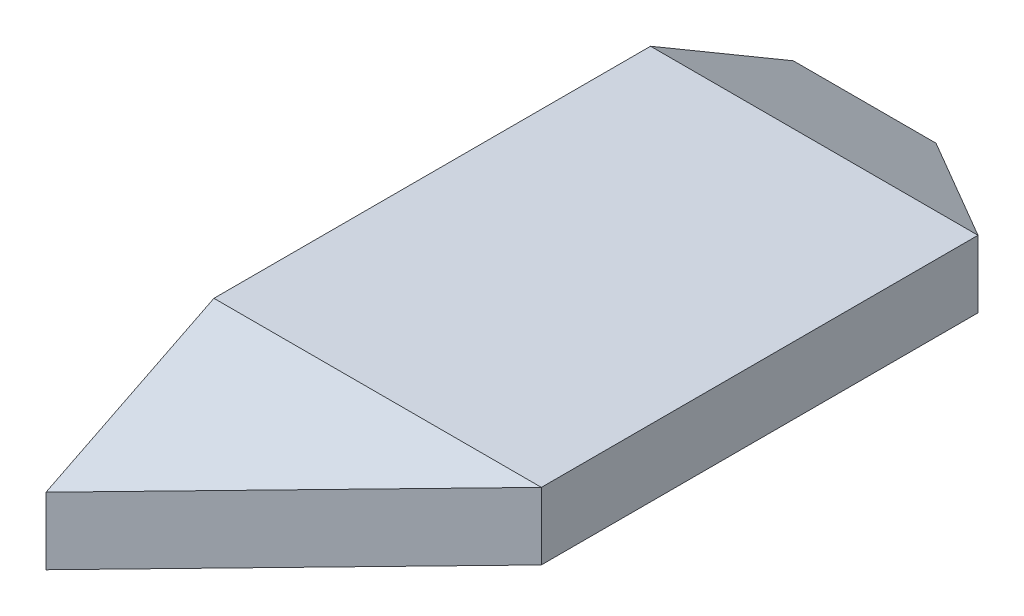
ISO-10303-21;
HEADER;
FILE_DESCRIPTION(('STEP AP214'),'2;1');
FILE_NAME('part.step','',(''),(''),'','','');
FILE_SCHEMA(('AUTOMOTIVE_DESIGN { 1 0 10303 214 1 1 1 1 }'));
ENDSEC;
DATA;
#1=APPLICATION_CONTEXT('core data for automotive mechanical design processes');
#2=APPLICATION_PROTOCOL_DEFINITION('international standard','automotive_design',2000,#1);
#3=PRODUCT_CONTEXT('',#1,'mechanical');
#4=PRODUCT('Part','Part','',(#3));
#5=PRODUCT_RELATED_PRODUCT_CATEGORY('part','',(#4));
#6=PRODUCT_DEFINITION_FORMATION('','',#4);
#7=PRODUCT_DEFINITION_CONTEXT('part definition',#1,'design');
#8=PRODUCT_DEFINITION('design','',#6,#7);
#9=PRODUCT_DEFINITION_SHAPE('','',#8);
#10=(LENGTH_UNIT() NAMED_UNIT(*) SI_UNIT(.MILLI.,.METRE.));
#11=(NAMED_UNIT(*) PLANE_ANGLE_UNIT() SI_UNIT($,.RADIAN.));
#12=(NAMED_UNIT(*) SI_UNIT($,.STERADIAN.) SOLID_ANGLE_UNIT());
#13=UNCERTAINTY_MEASURE_WITH_UNIT(LENGTH_MEASURE(1.E-05),#10,'distance_accuracy_value','');
#14=(GEOMETRIC_REPRESENTATION_CONTEXT(3) GLOBAL_UNCERTAINTY_ASSIGNED_CONTEXT((#13)) GLOBAL_UNIT_ASSIGNED_CONTEXT((#10,
#11,#12)) REPRESENTATION_CONTEXT('',''));
#15=CARTESIAN_POINT('',(0.,0.,0.));
#16=DIRECTION('',(0.,0.,1.));
#17=DIRECTION('',(1.,0.,0.));
#18=AXIS2_PLACEMENT_3D('',#15,#16,#17);
#19=CARTESIAN_POINT('',(0.,0.,0.));
#20=DIRECTION('',(0.,-1.,0.));
#21=DIRECTION('',(0.,0.,-1.));
#22=AXIS2_PLACEMENT_3D('',#19,#20,#21);
#23=PLANE('',#22);
#24=DIRECTION('',(-1.,0.,0.));
#25=VECTOR('',#24,1.);
#26=CARTESIAN_POINT('',(97.5,0.,-130.));
#27=LINE('',#26,#25);
#28=CARTESIAN_POINT('',(-92.5,0.,-130.));
#29=VERTEX_POINT('',#28);
#30=CARTESIAN_POINT('',(-97.5,0.,-130.));
#31=VERTEX_POINT('',#30);
#32=EDGE_CURVE('E285',#29,#31,#27,.T.);
#33=ORIENTED_EDGE('',*,*,#32,.F.);
#34=DIRECTION('',(0.,0.,1.));
#35=VECTOR('',#34,1.);
#36=CARTESIAN_POINT('',(-92.5,0.,0.));
#37=LINE('',#36,#35);
#38=CARTESIAN_POINT('',(-92.5,0.,130.));
#39=VERTEX_POINT('',#38);
#40=EDGE_CURVE('E181',#29,#39,#37,.T.);
#41=ORIENTED_EDGE('',*,*,#40,.T.);
#42=DIRECTION('',(1.,0.,0.));
#43=VECTOR('',#42,1.);
#44=CARTESIAN_POINT('',(97.5,0.,130.));
#45=LINE('',#44,#43);
#46=CARTESIAN_POINT('',(-97.5,0.,130.));
#47=VERTEX_POINT('',#46);
#48=EDGE_CURVE('E279',#47,#39,#45,.T.);
#49=ORIENTED_EDGE('',*,*,#48,.F.);
#50=DIRECTION('',(0.,0.,1.));
#51=VECTOR('',#50,1.);
#52=CARTESIAN_POINT('',(-97.5,0.,-130.));
#53=LINE('',#52,#51);
#54=EDGE_CURVE('E265',#31,#47,#53,.T.);
#55=ORIENTED_EDGE('',*,*,#54,.F.);
#56=EDGE_LOOP('',(#33,#41,#49,#55));
#57=FACE_BOUND('',#56,.T.);
#58=ADVANCED_FACE('F43',(#57),#23,.T.);
#59=CARTESIAN_POINT('',(97.5,-50.,230.));
#60=DIRECTION('',(0.,0.894427190999916,0.447213595499958));
#61=DIRECTION('',(0.,-0.447213595499958,0.894427190999916));
#62=AXIS2_PLACEMENT_3D('',#59,#60,#61);
#63=PLANE('',#62);
#64=DIRECTION('',(-0.867523903935252,-0.222442026650064,0.444884053300129));
#65=VECTOR('',#64,1.);
#66=CARTESIAN_POINT('',(46.5456943343876,-10.2556415808223,150.511283161645));
#67=LINE('',#66,#65);
#68=CARTESIAN_POINT('',(86.5426964995944,0.,130.));
#69=VERTEX_POINT('',#68);
#70=CARTESIAN_POINT('',(-92.5,-45.9083837178447,221.816767435689));
#71=VERTEX_POINT('',#70);
#72=EDGE_CURVE('E191',#69,#71,#67,.T.);
#73=ORIENTED_EDGE('',*,*,#72,.F.);
#74=CARTESIAN_POINT('',(97.5,0.,130.));
#75=VERTEX_POINT('',#74);
#76=EDGE_CURVE('E278',#69,#75,#45,.T.);
#77=ORIENTED_EDGE('',*,*,#76,.T.);
#78=DIRECTION('',(-0.867523903935252,-0.222442026650064,0.444884053300129));
#79=VECTOR('',#78,1.);
#80=CARTESIAN_POINT('',(49.2565561603167,-12.370113805047,154.740227610094));
#81=LINE('',#80,#79);
#82=CARTESIAN_POINT('',(-97.5,-50.,230.));
#83=VERTEX_POINT('',#82);
#84=EDGE_CURVE('E241',#75,#83,#81,.T.);
#85=ORIENTED_EDGE('',*,*,#84,.T.);
#86=DIRECTION('',(0.,0.447213595499958,-0.894427190999916));
#87=VECTOR('',#86,1.);
#88=CARTESIAN_POINT('',(-97.5,-50.,230.));
#89=LINE('',#88,#87);
#90=EDGE_CURVE('E259',#83,#47,#89,.T.);
#91=ORIENTED_EDGE('',*,*,#90,.T.);
#92=ORIENTED_EDGE('',*,*,#48,.T.);
#93=DIRECTION('',(0.,0.447213595499958,-0.894427190999916));
#94=VECTOR('',#93,1.);
#95=CARTESIAN_POINT('',(-92.5,-50.,230.));
#96=LINE('',#95,#94);
#97=EDGE_CURVE('E182',#71,#39,#96,.T.);
#98=ORIENTED_EDGE('',*,*,#97,.F.);
#99=EDGE_LOOP('',(#73,#77,#85,#91,#92,#98));
#100=FACE_BOUND('',#99,.T.);
#101=ADVANCED_FACE('F331',(#100),#63,.F.);
#102=CARTESIAN_POINT('',(97.5,0.,-130.));
#103=DIRECTION('',(0.,-0.86193421515777,0.507020126563394));
#104=DIRECTION('',(0.,-0.507020126563394,-0.86193421515777));
#105=AXIS2_PLACEMENT_3D('',#102,#103,#104);
#106=PLANE('',#105);
#107=CARTESIAN_POINT('',(97.5,0.,-130.));
#108=VERTEX_POINT('',#107);
#109=CARTESIAN_POINT('',(89.3226830738483,0.,-130.));
#110=VERTEX_POINT('',#109);
#111=EDGE_CURVE('E269',#108,#110,#27,.T.);
#112=ORIENTED_EDGE('',*,*,#111,.T.);
#113=DIRECTION('',(-0.744587187764654,-0.338448721711206,-0.575362826909051));
#114=VECTOR('',#113,1.);
#115=CARTESIAN_POINT('',(93.8562700065602,2.06072133305081,-126.496773733814));
#116=LINE('',#115,#114);
#117=CARTESIAN_POINT('',(-14.2067286908576,-47.0588235294118,-210.));
#118=VERTEX_POINT('',#117);
#119=EDGE_CURVE('E202',#110,#118,#116,.T.);
#120=ORIENTED_EDGE('',*,*,#119,.T.);
#121=DIRECTION('',(-1.,0.,0.));
#122=VECTOR('',#121,1.);
#123=CARTESIAN_POINT('',(97.5,-47.0588235294118,-210.));
#124=LINE('',#123,#122);
#125=CARTESIAN_POINT('',(-92.5,-47.0588235294118,-210.));
#126=VERTEX_POINT('',#125);
#127=EDGE_CURVE('E211',#118,#126,#124,.T.);
#128=ORIENTED_EDGE('',*,*,#127,.T.);
#129=DIRECTION('',(0.,0.507020126563394,0.86193421515777));
#130=VECTOR('',#129,1.);
#131=CARTESIAN_POINT('',(-92.5,0.,-130.));
#132=LINE('',#131,#130);
#133=EDGE_CURVE('E192',#126,#29,#132,.T.);
#134=ORIENTED_EDGE('',*,*,#133,.T.);
#135=ORIENTED_EDGE('',*,*,#32,.T.);
#136=DIRECTION('',(0.,0.507020126563394,0.861934215157769));
#137=VECTOR('',#136,1.);
#138=CARTESIAN_POINT('',(-97.5,0.,-130.));
#139=LINE('',#138,#137);
#140=CARTESIAN_POINT('',(-97.5,-50.,-215.));
#141=VERTEX_POINT('',#140);
#142=EDGE_CURVE('E250',#141,#31,#139,.T.);
#143=ORIENTED_EDGE('',*,*,#142,.F.);
#144=DIRECTION('',(-1.,0.,0.));
#145=VECTOR('',#144,1.);
#146=CARTESIAN_POINT('',(97.5,-50.,-215.));
#147=LINE('',#146,#145);
#148=CARTESIAN_POINT('',(-12.5,-50.,-215.));
#149=VERTEX_POINT('',#148);
#150=EDGE_CURVE('E254',#149,#141,#147,.T.);
#151=ORIENTED_EDGE('',*,*,#150,.F.);
#152=DIRECTION('',(-0.744587187764654,-0.338448721711206,-0.575362826909051));
#153=VECTOR('',#152,1.);
#154=CARTESIAN_POINT('',(97.5,0.,-130.));
#155=LINE('',#154,#153);
#156=EDGE_CURVE('E66',#108,#149,#155,.T.);
#157=ORIENTED_EDGE('',*,*,#156,.F.);
#158=EDGE_LOOP('',(#112,#120,#128,#134,#135,#143,#151,#157));
#159=FACE_BOUND('',#158,.T.);
#160=ADVANCED_FACE('F322',(#159),#106,.T.);
#161=CARTESIAN_POINT('',(-97.5,40.,-130.));
#162=DIRECTION('',(1.,0.,0.));
#163=DIRECTION('',(0.,0.,-1.));
#164=AXIS2_PLACEMENT_3D('',#161,#162,#163);
#165=PLANE('',#164);
#166=ORIENTED_EDGE('',*,*,#54,.T.);
#167=ORIENTED_EDGE('',*,*,#90,.F.);
#168=DIRECTION('',(0.,-1.,0.));
#169=VECTOR('',#168,1.);
#170=CARTESIAN_POINT('',(-97.5,-9.99999999999999,230.));
#171=LINE('',#170,#169);
#172=CARTESIAN_POINT('',(-97.5,-9.99999999999997,230.));
#173=VERTEX_POINT('',#172);
#174=EDGE_CURVE('E256',#173,#83,#171,.T.);
#175=ORIENTED_EDGE('',*,*,#174,.F.);
#176=DIRECTION('',(0.,-0.447213595499958,0.894427190999916));
#177=VECTOR('',#176,1.);
#178=CARTESIAN_POINT('',(-97.5,40.,130.));
#179=LINE('',#178,#177);
#180=CARTESIAN_POINT('',(-97.5,40.,130.));
#181=VERTEX_POINT('',#180);
#182=EDGE_CURVE('E262',#181,#173,#179,.T.);
#183=ORIENTED_EDGE('',*,*,#182,.F.);
#184=DIRECTION('',(0.,0.,1.));
#185=VECTOR('',#184,1.);
#186=CARTESIAN_POINT('',(-97.5,40.,-130.));
#187=LINE('',#186,#185);
#188=CARTESIAN_POINT('',(-97.5,40.,-130.));
#189=VERTEX_POINT('',#188);
#190=EDGE_CURVE('E266',#189,#181,#187,.T.);
#191=ORIENTED_EDGE('',*,*,#190,.F.);
#192=DIRECTION('',(0.,-0.507020126563394,-0.861934215157769));
#193=VECTOR('',#192,1.);
#194=CARTESIAN_POINT('',(-97.5,-10.,-215.));
#195=LINE('',#194,#193);
#196=CARTESIAN_POINT('',(-97.5,-10.,-215.));
#197=VERTEX_POINT('',#196);
#198=EDGE_CURVE('E244',#189,#197,#195,.T.);
#199=ORIENTED_EDGE('',*,*,#198,.T.);
#200=DIRECTION('',(0.,-1.,0.));
#201=VECTOR('',#200,1.);
#202=CARTESIAN_POINT('',(-97.5,-50.,-215.));
#203=LINE('',#202,#201);
#204=EDGE_CURVE('E247',#197,#141,#203,.T.);
#205=ORIENTED_EDGE('',*,*,#204,.T.);
#206=ORIENTED_EDGE('',*,*,#142,.T.);
#207=EDGE_LOOP('',(#166,#167,#175,#183,#191,#199,#205,#206));
#208=FACE_BOUND('',#207,.T.);
#209=ADVANCED_FACE('F45',(#208),#165,.F.);
#210=CARTESIAN_POINT('',(97.5,40.,-130.));
#211=DIRECTION('',(-1.,0.,0.));
#212=DIRECTION('',(0.,0.,1.));
#213=AXIS2_PLACEMENT_3D('',#210,#211,#212);
#214=PLANE('',#213);
#215=DIRECTION('',(0.,0.,-1.));
#216=VECTOR('',#215,1.);
#217=CARTESIAN_POINT('',(97.5,0.,-130.));
#218=LINE('',#217,#216);
#219=EDGE_CURVE('E282',#75,#108,#218,.T.);
#220=ORIENTED_EDGE('',*,*,#219,.T.);
#221=DIRECTION('',(0.,1.,0.));
#222=VECTOR('',#221,1.);
#223=CARTESIAN_POINT('',(97.5,-155.,-130.));
#224=LINE('',#223,#222);
#225=CARTESIAN_POINT('',(97.5,40.,-130.));
#226=VERTEX_POINT('',#225);
#227=EDGE_CURVE('E234',#108,#226,#224,.T.);
#228=ORIENTED_EDGE('',*,*,#227,.T.);
#229=DIRECTION('',(0.,0.,-1.));
#230=VECTOR('',#229,1.);
#231=CARTESIAN_POINT('',(97.5,40.,-130.));
#232=LINE('',#231,#230);
#233=CARTESIAN_POINT('',(97.5,40.,130.));
#234=VERTEX_POINT('',#233);
#235=EDGE_CURVE('E272',#234,#226,#232,.T.);
#236=ORIENTED_EDGE('',*,*,#235,.F.);
#237=DIRECTION('',(0.,1.,0.));
#238=VECTOR('',#237,1.);
#239=CARTESIAN_POINT('',(97.5,-155.,130.));
#240=LINE('',#239,#238);
#241=EDGE_CURVE('E233',#75,#234,#240,.T.);
#242=ORIENTED_EDGE('',*,*,#241,.F.);
#243=EDGE_LOOP('',(#220,#228,#236,#242));
#244=FACE_BOUND('',#243,.T.);
#245=ADVANCED_FACE('F315',(#244),#214,.F.);
#246=CARTESIAN_POINT('',(0.,40.,0.));
#247=DIRECTION('',(0.,-1.,0.));
#248=DIRECTION('',(0.,0.,-1.));
#249=AXIS2_PLACEMENT_3D('',#246,#247,#248);
#250=PLANE('',#249);
#251=ORIENTED_EDGE('',*,*,#190,.T.);
#252=DIRECTION('',(1.,0.,0.));
#253=VECTOR('',#252,1.);
#254=CARTESIAN_POINT('',(97.5,40.,130.));
#255=LINE('',#254,#253);
#256=EDGE_CURVE('E268',#181,#234,#255,.T.);
#257=ORIENTED_EDGE('',*,*,#256,.T.);
#258=ORIENTED_EDGE('',*,*,#235,.T.);
#259=DIRECTION('',(-1.,0.,0.));
#260=VECTOR('',#259,1.);
#261=CARTESIAN_POINT('',(97.5,40.,-130.));
#262=LINE('',#261,#260);
#263=EDGE_CURVE('E275',#226,#189,#262,.T.);
#264=ORIENTED_EDGE('',*,*,#263,.T.);
#265=EDGE_LOOP('',(#251,#257,#258,#264));
#266=FACE_BOUND('',#265,.T.);
#267=ADVANCED_FACE('F305',(#266),#250,.F.);
#268=DIRECTION('',(0.791285001392167,0.,0.611447501075765));
#269=VECTOR('',#268,1.);
#270=CARTESIAN_POINT('',(-15.5572375053788,0.,-211.043574993039));
#271=LINE('',#270,#269);
#272=CARTESIAN_POINT('',(92.5,0.,-127.544800557065));
#273=VERTEX_POINT('',#272);
#274=EDGE_CURVE('E216',#110,#273,#271,.T.);
#275=ORIENTED_EDGE('',*,*,#274,.F.);
#276=ORIENTED_EDGE('',*,*,#111,.F.);
#277=ORIENTED_EDGE('',*,*,#219,.F.);
#278=ORIENTED_EDGE('',*,*,#76,.F.);
#279=DIRECTION('',(0.889817462812737,0.,-0.456316647596275));
#280=VECTOR('',#279,1.);
#281=CARTESIAN_POINT('',(70.8053506506183,0.,138.070433768706));
#282=LINE('',#281,#280);
#283=CARTESIAN_POINT('',(92.5,0.,126.944972563895));
#284=VERTEX_POINT('',#283);
#285=EDGE_CURVE('E230',#69,#284,#282,.T.);
#286=ORIENTED_EDGE('',*,*,#285,.T.);
#287=DIRECTION('',(0.,0.,-1.));
#288=VECTOR('',#287,1.);
#289=CARTESIAN_POINT('',(92.5,0.,0.));
#290=LINE('',#289,#288);
#291=EDGE_CURVE('E169',#284,#273,#290,.T.);
#292=ORIENTED_EDGE('',*,*,#291,.T.);
#293=EDGE_LOOP('',(#275,#276,#277,#278,#286,#292));
#294=FACE_BOUND('',#293,.T.);
#295=ADVANCED_FACE('F320',(#294),#23,.T.);
#296=CARTESIAN_POINT('',(97.5,40.,130.));
#297=DIRECTION('',(0.,-0.894427190999916,-0.447213595499958));
#298=DIRECTION('',(0.,0.447213595499958,-0.894427190999916));
#299=AXIS2_PLACEMENT_3D('',#296,#297,#298);
#300=PLANE('',#299);
#301=ORIENTED_EDGE('',*,*,#182,.T.);
#302=DIRECTION('',(0.867523903935252,0.222442026650064,-0.444884053300129));
#303=VECTOR('',#302,1.);
#304=CARTESIAN_POINT('',(97.5,40.,130.));
#305=LINE('',#304,#303);
#306=EDGE_CURVE('E11',#173,#234,#305,.T.);
#307=ORIENTED_EDGE('',*,*,#306,.T.);
#308=ORIENTED_EDGE('',*,*,#256,.F.);
#309=EDGE_LOOP('',(#301,#307,#308));
#310=FACE_BOUND('',#309,.T.);
#311=ADVANCED_FACE('F308',(#310),#300,.F.);
#312=CARTESIAN_POINT('',(97.5,-10.,-215.));
#313=DIRECTION('',(0.,0.86193421515777,-0.507020126563394));
#314=DIRECTION('',(0.,0.507020126563394,0.86193421515777));
#315=AXIS2_PLACEMENT_3D('',#312,#313,#314);
#316=PLANE('',#315);
#317=DIRECTION('',(0.744587187764654,0.338448721711206,0.575362826909051));
#318=VECTOR('',#317,1.);
#319=CARTESIAN_POINT('',(48.4851088201604,17.7205040091638,-167.875143184422));
#320=LINE('',#319,#318);
#321=CARTESIAN_POINT('',(-12.5,-10.,-215.));
#322=VERTEX_POINT('',#321);
#323=EDGE_CURVE('E239',#322,#226,#320,.T.);
#324=ORIENTED_EDGE('',*,*,#323,.F.);
#325=DIRECTION('',(-1.,0.,0.));
#326=VECTOR('',#325,1.);
#327=CARTESIAN_POINT('',(97.5,-10.,-215.));
#328=LINE('',#327,#326);
#329=EDGE_CURVE('E253',#322,#197,#328,.T.);
#330=ORIENTED_EDGE('',*,*,#329,.T.);
#331=ORIENTED_EDGE('',*,*,#198,.F.);
#332=ORIENTED_EDGE('',*,*,#263,.F.);
#333=EDGE_LOOP('',(#324,#330,#331,#332));
#334=FACE_BOUND('',#333,.T.);
#335=ADVANCED_FACE('F294',(#334),#316,.T.);
#336=CARTESIAN_POINT('',(97.5,-50.,-215.));
#337=DIRECTION('',(0.,0.,-1.));
#338=DIRECTION('',(-1.,0.,0.));
#339=AXIS2_PLACEMENT_3D('',#336,#337,#338);
#340=PLANE('',#339);
#341=DIRECTION('',(0.,1.,0.));
#342=VECTOR('',#341,1.);
#343=CARTESIAN_POINT('',(-12.5,-50.,-215.));
#344=LINE('',#343,#342);
#345=EDGE_CURVE('E51',#149,#322,#344,.T.);
#346=ORIENTED_EDGE('',*,*,#345,.F.);
#347=ORIENTED_EDGE('',*,*,#150,.T.);
#348=ORIENTED_EDGE('',*,*,#204,.F.);
#349=ORIENTED_EDGE('',*,*,#329,.F.);
#350=EDGE_LOOP('',(#346,#347,#348,#349));
#351=FACE_BOUND('',#350,.T.);
#352=ADVANCED_FACE('F297',(#351),#340,.T.);
#353=CARTESIAN_POINT('',(-12.5,-155.,-215.));
#354=DIRECTION('',(-0.611447501075765,0.,0.791285001392167));
#355=DIRECTION('',(0.791285001392167,0.,0.611447501075765));
#356=AXIS2_PLACEMENT_3D('',#353,#354,#355);
#357=PLANE('',#356);
#358=ORIENTED_EDGE('',*,*,#323,.T.);
#359=ORIENTED_EDGE('',*,*,#227,.F.);
#360=ORIENTED_EDGE('',*,*,#156,.T.);
#361=ORIENTED_EDGE('',*,*,#345,.T.);
#362=EDGE_LOOP('',(#358,#359,#360,#361));
#363=FACE_BOUND('',#362,.T.);
#364=ADVANCED_FACE('F288',(#363),#357,.F.);
#365=CARTESIAN_POINT('',(-97.5,-155.,230.));
#366=DIRECTION('',(-0.456316647596275,0.,-0.889817462812737));
#367=DIRECTION('',(-0.889817462812737,0.,0.456316647596275));
#368=AXIS2_PLACEMENT_3D('',#365,#366,#367);
#369=PLANE('',#368);
#370=ORIENTED_EDGE('',*,*,#241,.T.);
#371=ORIENTED_EDGE('',*,*,#306,.F.);
#372=ORIENTED_EDGE('',*,*,#174,.T.);
#373=ORIENTED_EDGE('',*,*,#84,.F.);
#374=EDGE_LOOP('',(#370,#371,#372,#373));
#375=FACE_BOUND('',#374,.T.);
#376=ADVANCED_FACE('F310',(#375),#369,.F.);
#377=CARTESIAN_POINT('',(-92.5,40.,-130.));
#378=DIRECTION('',(1.,0.,0.));
#379=DIRECTION('',(0.,0.,-1.));
#380=AXIS2_PLACEMENT_3D('',#377,#378,#379);
#381=PLANE('',#380);
#382=ORIENTED_EDGE('',*,*,#40,.F.);
#383=ORIENTED_EDGE('',*,*,#133,.F.);
#384=DIRECTION('',(0.,-1.,0.));
#385=VECTOR('',#384,1.);
#386=CARTESIAN_POINT('',(-92.5,-50.,-210.));
#387=LINE('',#386,#385);
#388=CARTESIAN_POINT('',(-92.5,-12.8597302715635,-210.));
#389=VERTEX_POINT('',#388);
#390=EDGE_CURVE('E58',#389,#126,#387,.T.);
#391=ORIENTED_EDGE('',*,*,#390,.F.);
#392=DIRECTION('',(0.,-0.507020126563394,-0.86193421515777));
#393=VECTOR('',#392,1.);
#394=CARTESIAN_POINT('',(-92.5,-14.3096710757889,-212.464899367183));
#395=LINE('',#394,#393);
#396=CARTESIAN_POINT('',(-92.5,35.,-128.638458538342));
#397=VERTEX_POINT('',#396);
#398=EDGE_CURVE('E165',#397,#389,#395,.T.);
#399=ORIENTED_EDGE('',*,*,#398,.F.);
#400=DIRECTION('',(0.,0.,1.));
#401=VECTOR('',#400,1.);
#402=CARTESIAN_POINT('',(-92.5,35.,0.));
#403=LINE('',#402,#401);
#404=CARTESIAN_POINT('',(-92.5,35.,128.819660112501));
#405=VERTEX_POINT('',#404);
#406=EDGE_CURVE('E158',#397,#405,#403,.T.);
#407=ORIENTED_EDGE('',*,*,#406,.T.);
#408=DIRECTION('',(0.,-0.447213595499958,0.894427190999916));
#409=VECTOR('',#408,1.);
#410=CARTESIAN_POINT('',(-92.5,35.5278640450004,127.7639320225));
#411=LINE('',#410,#409);
#412=CARTESIAN_POINT('',(-92.5,-11.4985536615942,221.816767435689));
#413=VERTEX_POINT('',#412);
#414=EDGE_CURVE('E162',#405,#413,#411,.T.);
#415=ORIENTED_EDGE('',*,*,#414,.T.);
#416=DIRECTION('',(0.,-1.,0.));
#417=VECTOR('',#416,1.);
#418=CARTESIAN_POINT('',(-92.5,-155.,221.816767435689));
#419=LINE('',#418,#417);
#420=EDGE_CURVE('E186',#413,#71,#419,.T.);
#421=ORIENTED_EDGE('',*,*,#420,.T.);
#422=ORIENTED_EDGE('',*,*,#97,.T.);
#423=EDGE_LOOP('',(#382,#383,#391,#399,#407,#415,#421,#422));
#424=FACE_BOUND('',#423,.T.);
#425=ADVANCED_FACE('F160',(#424),#381,.T.);
#426=CARTESIAN_POINT('',(92.5,40.,-130.));
#427=DIRECTION('',(-1.,0.,0.));
#428=DIRECTION('',(0.,0.,1.));
#429=AXIS2_PLACEMENT_3D('',#426,#427,#428);
#430=PLANE('',#429);
#431=ORIENTED_EDGE('',*,*,#291,.F.);
#432=DIRECTION('',(0.,1.,0.));
#433=VECTOR('',#432,1.);
#434=CARTESIAN_POINT('',(92.5,-155.,126.944972563895));
#435=LINE('',#434,#433);
#436=CARTESIAN_POINT('',(92.5,35.,126.944972563895));
#437=VERTEX_POINT('',#436);
#438=EDGE_CURVE('E203',#284,#437,#435,.T.);
#439=ORIENTED_EDGE('',*,*,#438,.T.);
#440=DIRECTION('',(0.,0.,-1.));
#441=VECTOR('',#440,1.);
#442=CARTESIAN_POINT('',(92.5,35.,0.));
#443=LINE('',#442,#441);
#444=CARTESIAN_POINT('',(92.5,35.,-127.544800557065));
#445=VERTEX_POINT('',#444);
#446=EDGE_CURVE('E177',#437,#445,#443,.T.);
#447=ORIENTED_EDGE('',*,*,#446,.T.);
#448=DIRECTION('',(0.,1.,0.));
#449=VECTOR('',#448,1.);
#450=CARTESIAN_POINT('',(92.5,40.,-127.544800557065));
#451=LINE('',#450,#449);
#452=EDGE_CURVE('E199',#273,#445,#451,.T.);
#453=ORIENTED_EDGE('',*,*,#452,.F.);
#454=EDGE_LOOP('',(#431,#439,#447,#453));
#455=FACE_BOUND('',#454,.T.);
#456=ADVANCED_FACE('F336',(#455),#430,.T.);
#457=CARTESIAN_POINT('',(0.,35.,0.));
#458=DIRECTION('',(0.,-1.,0.));
#459=DIRECTION('',(0.,0.,-1.));
#460=AXIS2_PLACEMENT_3D('',#457,#458,#459);
#461=PLANE('',#460);
#462=ORIENTED_EDGE('',*,*,#406,.F.);
#463=DIRECTION('',(-1.,0.,0.));
#464=VECTOR('',#463,1.);
#465=CARTESIAN_POINT('',(97.5,35.,-128.638458538342));
#466=LINE('',#465,#464);
#467=CARTESIAN_POINT('',(91.0846779065823,35.,-128.638458538342));
#468=VERTEX_POINT('',#467);
#469=EDGE_CURVE('E196',#468,#397,#466,.T.);
#470=ORIENTED_EDGE('',*,*,#469,.F.);
#471=DIRECTION('',(-0.791285001392167,0.,-0.611447501075765));
#472=VECTOR('',#471,1.);
#473=CARTESIAN_POINT('',(96.2926978115681,35.,-124.614079520853));
#474=LINE('',#473,#472);
#475=EDGE_CURVE('E214',#445,#468,#474,.T.);
#476=ORIENTED_EDGE('',*,*,#475,.F.);
#477=ORIENTED_EDGE('',*,*,#446,.F.);
#478=DIRECTION('',(-0.889817462812737,0.,0.456316647596275));
#479=VECTOR('',#478,1.);
#480=CARTESIAN_POINT('',(-99.7815832379814,35.,225.550912685936));
#481=LINE('',#480,#479);
#482=CARTESIAN_POINT('',(88.8443592802175,35.,128.819660112501));
#483=VERTEX_POINT('',#482);
#484=EDGE_CURVE('E174',#437,#483,#481,.T.);
#485=ORIENTED_EDGE('',*,*,#484,.T.);
#486=DIRECTION('',(1.,0.,0.));
#487=VECTOR('',#486,1.);
#488=CARTESIAN_POINT('',(0.,35.,128.819660112501));
#489=LINE('',#488,#487);
#490=EDGE_CURVE('E168',#405,#483,#489,.T.);
#491=ORIENTED_EDGE('',*,*,#490,.F.);
#492=EDGE_LOOP('',(#462,#470,#476,#477,#485,#491));
#493=FACE_BOUND('',#492,.T.);
#494=ADVANCED_FACE('F172',(#493),#461,.T.);
#495=CARTESIAN_POINT('',(97.5,35.5278640450004,127.7639320225));
#496=DIRECTION('',(0.,-0.894427190999916,-0.447213595499958));
#497=DIRECTION('',(0.,0.447213595499958,-0.894427190999916));
#498=AXIS2_PLACEMENT_3D('',#495,#496,#497);
#499=PLANE('',#498);
#500=ORIENTED_EDGE('',*,*,#414,.F.);
#501=ORIENTED_EDGE('',*,*,#490,.T.);
#502=DIRECTION('',(0.867523903935252,0.222442026650064,-0.444884053300129));
#503=VECTOR('',#502,1.);
#504=CARTESIAN_POINT('',(95.8678943730131,36.8009064340502,125.217847244401));
#505=LINE('',#504,#503);
#506=EDGE_CURVE('E180',#413,#483,#505,.T.);
#507=ORIENTED_EDGE('',*,*,#506,.F.);
#508=EDGE_LOOP('',(#500,#501,#507));
#509=FACE_BOUND('',#508,.T.);
#510=ADVANCED_FACE('F179',(#509),#499,.T.);
#511=CARTESIAN_POINT('',(97.5,-14.3096710757889,-212.464899367183));
#512=DIRECTION('',(0.,0.86193421515777,-0.507020126563394));
#513=DIRECTION('',(0.,0.507020126563394,0.86193421515777));
#514=AXIS2_PLACEMENT_3D('',#511,#512,#513);
#515=PLANE('',#514);
#516=DIRECTION('',(0.744587187764654,0.338448721711206,0.575362826909051));
#517=VECTOR('',#516,1.);
#518=CARTESIAN_POINT('',(46.303233904926,14.6447981810653,-163.242301630531));
#519=LINE('',#518,#517);
#520=CARTESIAN_POINT('',(-14.2067286908576,-12.8597302715635,-210.));
#521=VERTEX_POINT('',#520);
#522=EDGE_CURVE('E207',#521,#468,#519,.T.);
#523=ORIENTED_EDGE('',*,*,#522,.T.);
#524=ORIENTED_EDGE('',*,*,#469,.T.);
#525=ORIENTED_EDGE('',*,*,#398,.T.);
#526=DIRECTION('',(-1.,0.,0.));
#527=VECTOR('',#526,1.);
#528=CARTESIAN_POINT('',(97.5,-12.8597302715635,-210.));
#529=LINE('',#528,#527);
#530=EDGE_CURVE('E209',#521,#389,#529,.T.);
#531=ORIENTED_EDGE('',*,*,#530,.F.);
#532=EDGE_LOOP('',(#523,#524,#525,#531));
#533=FACE_BOUND('',#532,.T.);
#534=ADVANCED_FACE('F343',(#533),#515,.F.);
#535=CARTESIAN_POINT('',(97.5,-50.,-210.));
#536=DIRECTION('',(0.,0.,-1.));
#537=DIRECTION('',(-1.,0.,0.));
#538=AXIS2_PLACEMENT_3D('',#535,#536,#537);
#539=PLANE('',#538);
#540=DIRECTION('',(0.,1.,0.));
#541=VECTOR('',#540,1.);
#542=CARTESIAN_POINT('',(-14.2067286908576,-50.,-210.));
#543=LINE('',#542,#541);
#544=EDGE_CURVE('E198',#118,#521,#543,.T.);
#545=ORIENTED_EDGE('',*,*,#544,.T.);
#546=ORIENTED_EDGE('',*,*,#530,.T.);
#547=ORIENTED_EDGE('',*,*,#390,.T.);
#548=ORIENTED_EDGE('',*,*,#127,.F.);
#549=EDGE_LOOP('',(#545,#546,#547,#548));
#550=FACE_BOUND('',#549,.T.);
#551=ADVANCED_FACE('F341',(#550),#539,.F.);
#552=CARTESIAN_POINT('',(-15.5572375053788,-155.,-211.043574993039));
#553=DIRECTION('',(-0.611447501075765,0.,0.791285001392167));
#554=DIRECTION('',(0.791285001392167,0.,0.611447501075765));
#555=AXIS2_PLACEMENT_3D('',#552,#553,#554);
#556=PLANE('',#555);
#557=ORIENTED_EDGE('',*,*,#522,.F.);
#558=ORIENTED_EDGE('',*,*,#544,.F.);
#559=ORIENTED_EDGE('',*,*,#119,.F.);
#560=ORIENTED_EDGE('',*,*,#274,.T.);
#561=ORIENTED_EDGE('',*,*,#452,.T.);
#562=ORIENTED_EDGE('',*,*,#475,.T.);
#563=EDGE_LOOP('',(#557,#558,#559,#560,#561,#562));
#564=FACE_BOUND('',#563,.T.);
#565=ADVANCED_FACE('F339',(#564),#556,.T.);
#566=CARTESIAN_POINT('',(-99.7815832379814,-155.,225.550912685936));
#567=DIRECTION('',(-0.456316647596275,0.,-0.889817462812737));
#568=DIRECTION('',(-0.889817462812737,0.,0.456316647596275));
#569=AXIS2_PLACEMENT_3D('',#566,#567,#568);
#570=PLANE('',#569);
#571=ORIENTED_EDGE('',*,*,#438,.F.);
#572=ORIENTED_EDGE('',*,*,#285,.F.);
#573=ORIENTED_EDGE('',*,*,#72,.T.);
#574=ORIENTED_EDGE('',*,*,#420,.F.);
#575=ORIENTED_EDGE('',*,*,#506,.T.);
#576=ORIENTED_EDGE('',*,*,#484,.F.);
#577=EDGE_LOOP('',(#571,#572,#573,#574,#575,#576));
#578=FACE_BOUND('',#577,.T.);
#579=ADVANCED_FACE('F334',(#578),#570,.T.);
#580=CLOSED_SHELL('',(#58,#101,#160,#209,#245,#267,#295,#311,#335,#352,#364,#376,#425,#456,#494,
#510,#534,#551,#565,#579));
#581=MANIFOLD_SOLID_BREP('B2',#580);
#582=ADVANCED_BREP_SHAPE_REPRESENTATION('',(#18,#581),#14);
#583=SHAPE_DEFINITION_REPRESENTATION(#9,#582);
ENDSEC;
END-ISO-10303-21;
